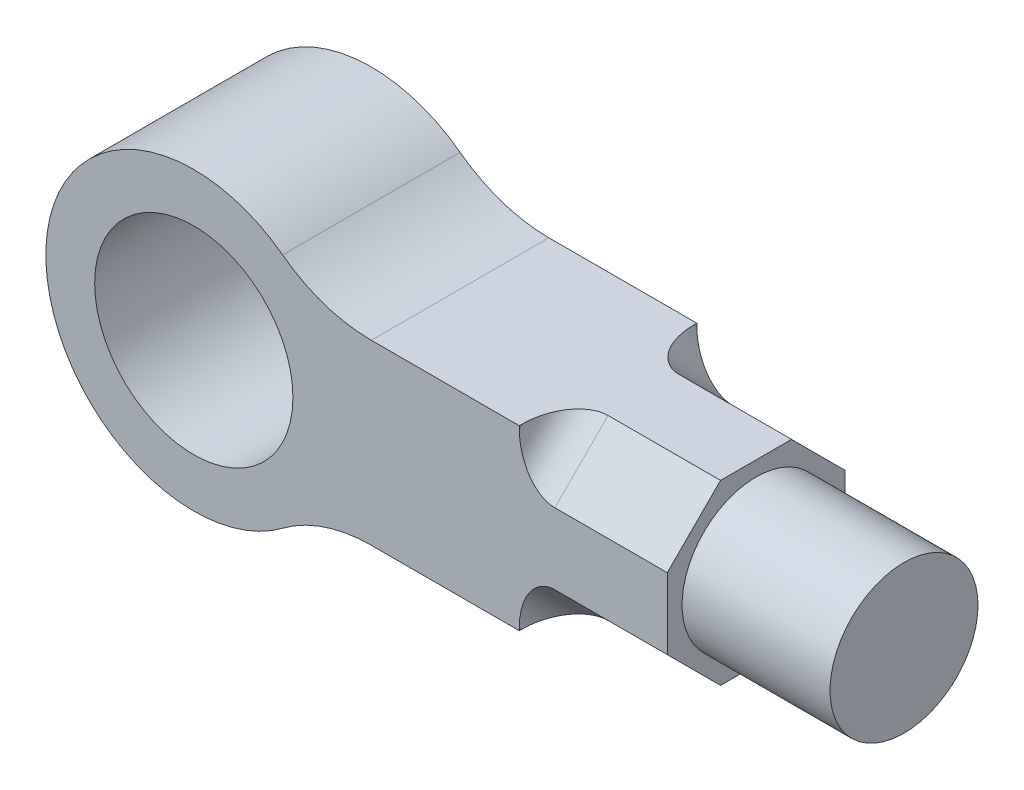
ISO-10303-21;
HEADER;
FILE_DESCRIPTION(('STEP AP214'),'2;1');
FILE_NAME('part.step','',(''),(''),'','','');
FILE_SCHEMA(('AUTOMOTIVE_DESIGN { 1 0 10303 214 1 1 1 1 }'));
ENDSEC;
DATA;
#1=APPLICATION_CONTEXT('core data for automotive mechanical design processes');
#2=APPLICATION_PROTOCOL_DEFINITION('international standard','automotive_design',2000,#1);
#3=PRODUCT_CONTEXT('',#1,'mechanical');
#4=PRODUCT('Part','Part','',(#3));
#5=PRODUCT_RELATED_PRODUCT_CATEGORY('part','',(#4));
#6=PRODUCT_DEFINITION_FORMATION('','',#4);
#7=PRODUCT_DEFINITION_CONTEXT('part definition',#1,'design');
#8=PRODUCT_DEFINITION('design','',#6,#7);
#9=PRODUCT_DEFINITION_SHAPE('','',#8);
#10=(LENGTH_UNIT() NAMED_UNIT(*) SI_UNIT(.MILLI.,.METRE.));
#11=(NAMED_UNIT(*) PLANE_ANGLE_UNIT() SI_UNIT($,.RADIAN.));
#12=(NAMED_UNIT(*) SI_UNIT($,.STERADIAN.) SOLID_ANGLE_UNIT());
#13=UNCERTAINTY_MEASURE_WITH_UNIT(LENGTH_MEASURE(1.E-05),#10,'distance_accuracy_value','');
#14=(GEOMETRIC_REPRESENTATION_CONTEXT(3) GLOBAL_UNCERTAINTY_ASSIGNED_CONTEXT((#13)) GLOBAL_UNIT_ASSIGNED_CONTEXT((#10,
#11,#12)) REPRESENTATION_CONTEXT('',''));
#15=CARTESIAN_POINT('',(0.,0.,0.));
#16=DIRECTION('',(0.,0.,1.));
#17=DIRECTION('',(1.,0.,0.));
#18=AXIS2_PLACEMENT_3D('',#15,#16,#17);
#19=CARTESIAN_POINT('',(60.,-80.,60.));
#20=DIRECTION('',(0.,0.,-1.));
#21=DIRECTION('',(-1.,0.,0.));
#22=AXIS2_PLACEMENT_3D('',#19,#20,#21);
#23=PLANE('',#22);
#24=CARTESIAN_POINT('',(0.,0.,60.));
#25=DIRECTION('',(0.,0.,1.));
#26=DIRECTION('',(1.,0.,0.));
#27=AXIS2_PLACEMENT_3D('',#24,#25,#26);
#28=CIRCLE('',#27,33.5);
#29=CARTESIAN_POINT('',(33.5,0.,60.));
#30=VERTEX_POINT('',#29);
#31=EDGE_CURVE('E355',#30,#30,#28,.T.);
#32=ORIENTED_EDGE('',*,*,#31,.F.);
#33=EDGE_LOOP('',(#32));
#34=FACE_BOUND('',#33,.T.);
#35=DIRECTION('',(0.,-1.,0.));
#36=VECTOR('',#35,1.);
#37=CARTESIAN_POINT('',(110.,0.,60.));
#38=LINE('',#37,#36);
#39=CARTESIAN_POINT('',(110.,-28.9705627484766,60.));
#40=VERTEX_POINT('',#39);
#41=CARTESIAN_POINT('',(110.,-30.,60.));
#42=VERTEX_POINT('',#41);
#43=EDGE_CURVE('E331',#40,#42,#38,.T.);
#44=ORIENTED_EDGE('',*,*,#43,.F.);
#45=CARTESIAN_POINT('',(122.,-28.9705627484766,60.));
#46=DIRECTION('',(0.,0.,-1.));
#47=DIRECTION('',(0.,1.,0.));
#48=AXIS2_PLACEMENT_3D('',#45,#46,#47);
#49=ELLIPSE('',#48,16.9705627484773,12.);
#50=CARTESIAN_POINT('',(122.,-12.0000000000001,60.));
#51=VERTEX_POINT('',#50);
#52=EDGE_CURVE('E245',#40,#51,#49,.T.);
#53=ORIENTED_EDGE('',*,*,#52,.T.);
#54=DIRECTION('',(1.,0.,0.));
#55=VECTOR('',#54,1.);
#56=CARTESIAN_POINT('',(110.,-12.0000000000001,60.));
#57=LINE('',#56,#55);
#58=CARTESIAN_POINT('',(160.,-12.0000000000001,60.));
#59=VERTEX_POINT('',#58);
#60=EDGE_CURVE('E337',#51,#59,#57,.T.);
#61=ORIENTED_EDGE('',*,*,#60,.T.);
#62=DIRECTION('',(0.,1.,0.));
#63=VECTOR('',#62,1.);
#64=CARTESIAN_POINT('',(160.,30.,60.));
#65=LINE('',#64,#63);
#66=CARTESIAN_POINT('',(160.,11.9999999999997,60.));
#67=VERTEX_POINT('',#66);
#68=EDGE_CURVE('E365',#59,#67,#65,.T.);
#69=ORIENTED_EDGE('',*,*,#68,.T.);
#70=DIRECTION('',(1.,0.,0.));
#71=VECTOR('',#70,1.);
#72=CARTESIAN_POINT('',(110.,11.9999999999997,60.));
#73=LINE('',#72,#71);
#74=CARTESIAN_POINT('',(122.,11.9999999999997,60.));
#75=VERTEX_POINT('',#74);
#76=EDGE_CURVE('E351',#75,#67,#73,.T.);
#77=ORIENTED_EDGE('',*,*,#76,.F.);
#78=CARTESIAN_POINT('',(122.,28.9705627484763,60.));
#79=DIRECTION('',(0.,0.,-1.));
#80=DIRECTION('',(0.,1.,0.));
#81=AXIS2_PLACEMENT_3D('',#78,#79,#80);
#82=ELLIPSE('',#81,16.970562748477,12.);
#83=CARTESIAN_POINT('',(110.,28.9705627484763,60.));
#84=VERTEX_POINT('',#83);
#85=EDGE_CURVE('E42',#75,#84,#82,.T.);
#86=ORIENTED_EDGE('',*,*,#85,.T.);
#87=DIRECTION('',(0.,-1.,0.));
#88=VECTOR('',#87,1.);
#89=CARTESIAN_POINT('',(110.,0.,60.));
#90=LINE('',#89,#88);
#91=CARTESIAN_POINT('',(110.,30.,60.));
#92=VERTEX_POINT('',#91);
#93=EDGE_CURVE('E345',#92,#84,#90,.T.);
#94=ORIENTED_EDGE('',*,*,#93,.F.);
#95=DIRECTION('',(-1.,0.,0.));
#96=VECTOR('',#95,1.);
#97=CARTESIAN_POINT('',(60.,30.,60.));
#98=LINE('',#97,#96);
#99=CARTESIAN_POINT('',(60.,30.,60.));
#100=VERTEX_POINT('',#99);
#101=EDGE_CURVE('E368',#92,#100,#98,.T.);
#102=ORIENTED_EDGE('',*,*,#101,.T.);
#103=CARTESIAN_POINT('',(60.,80.,60.));
#104=DIRECTION('',(0.,0.,-1.));
#105=DIRECTION('',(-1.,0.,0.));
#106=AXIS2_PLACEMENT_3D('',#103,#104,#105);
#107=CIRCLE('',#106,50.);
#108=CARTESIAN_POINT('',(30.,40.,60.));
#109=VERTEX_POINT('',#108);
#110=EDGE_CURVE('E370',#100,#109,#107,.T.);
#111=ORIENTED_EDGE('',*,*,#110,.T.);
#112=CARTESIAN_POINT('',(0.,0.,60.));
#113=DIRECTION('',(0.,0.,1.));
#114=DIRECTION('',(1.,0.,0.));
#115=AXIS2_PLACEMENT_3D('',#112,#113,#114);
#116=CIRCLE('',#115,50.);
#117=CARTESIAN_POINT('',(30.,-40.,60.));
#118=VERTEX_POINT('',#117);
#119=EDGE_CURVE('E207',#109,#118,#116,.T.);
#120=ORIENTED_EDGE('',*,*,#119,.T.);
#121=CARTESIAN_POINT('',(60.,-80.,60.));
#122=DIRECTION('',(0.,0.,-1.));
#123=DIRECTION('',(-1.,0.,0.));
#124=AXIS2_PLACEMENT_3D('',#121,#122,#123);
#125=CIRCLE('',#124,50.);
#126=CARTESIAN_POINT('',(60.,-30.,60.));
#127=VERTEX_POINT('',#126);
#128=EDGE_CURVE('E202',#118,#127,#125,.T.);
#129=ORIENTED_EDGE('',*,*,#128,.T.);
#130=DIRECTION('',(1.,0.,0.));
#131=VECTOR('',#130,1.);
#132=CARTESIAN_POINT('',(60.,-30.,60.));
#133=LINE('',#132,#131);
#134=EDGE_CURVE('E362',#127,#42,#133,.T.);
#135=ORIENTED_EDGE('',*,*,#134,.T.);
#136=EDGE_LOOP('',(#44,#53,#61,#69,#77,#86,#94,#102,#111,#120,#129,#135));
#137=FACE_BOUND('',#136,.T.);
#138=ADVANCED_FACE('F34',(#34,#137),#23,.F.);
#139=CARTESIAN_POINT('',(60.,-80.,0.));
#140=DIRECTION('',(0.,0.,-1.));
#141=DIRECTION('',(-1.,0.,0.));
#142=AXIS2_PLACEMENT_3D('',#139,#140,#141);
#143=PLANE('',#142);
#144=CARTESIAN_POINT('',(0.,0.,0.));
#145=DIRECTION('',(0.,0.,1.));
#146=DIRECTION('',(1.,0.,0.));
#147=AXIS2_PLACEMENT_3D('',#144,#145,#146);
#148=CIRCLE('',#147,33.5);
#149=CARTESIAN_POINT('',(33.5,0.,0.));
#150=VERTEX_POINT('',#149);
#151=EDGE_CURVE('E353',#150,#150,#148,.T.);
#152=ORIENTED_EDGE('',*,*,#151,.T.);
#153=EDGE_LOOP('',(#152));
#154=FACE_BOUND('',#153,.T.);
#155=DIRECTION('',(0.,1.,0.));
#156=VECTOR('',#155,1.);
#157=CARTESIAN_POINT('',(160.,30.,0.));
#158=LINE('',#157,#156);
#159=CARTESIAN_POINT('',(160.,-11.9999999999999,0.));
#160=VERTEX_POINT('',#159);
#161=CARTESIAN_POINT('',(160.,12.,0.));
#162=VERTEX_POINT('',#161);
#163=EDGE_CURVE('E163',#160,#162,#158,.T.);
#164=ORIENTED_EDGE('',*,*,#163,.F.);
#165=DIRECTION('',(1.,0.,0.));
#166=VECTOR('',#165,1.);
#167=CARTESIAN_POINT('',(110.,-11.9999999999999,0.));
#168=LINE('',#167,#166);
#169=CARTESIAN_POINT('',(122.,-11.9999999999999,0.));
#170=VERTEX_POINT('',#169);
#171=EDGE_CURVE('E181',#170,#160,#168,.T.);
#172=ORIENTED_EDGE('',*,*,#171,.F.);
#173=CARTESIAN_POINT('',(122.,-28.9705627484775,0.));
#174=DIRECTION('',(0.,0.,-1.));
#175=DIRECTION('',(0.,-1.,0.));
#176=AXIS2_PLACEMENT_3D('',#173,#174,#175);
#177=ELLIPSE('',#176,16.9705627484771,12.);
#178=CARTESIAN_POINT('',(110.,-28.9705627484775,0.));
#179=VERTEX_POINT('',#178);
#180=EDGE_CURVE('E239',#170,#179,#177,.F.);
#181=ORIENTED_EDGE('',*,*,#180,.T.);
#182=DIRECTION('',(0.,1.,0.));
#183=VECTOR('',#182,1.);
#184=CARTESIAN_POINT('',(110.,0.,0.));
#185=LINE('',#184,#183);
#186=CARTESIAN_POINT('',(110.,-30.,0.));
#187=VERTEX_POINT('',#186);
#188=EDGE_CURVE('E324',#187,#179,#185,.T.);
#189=ORIENTED_EDGE('',*,*,#188,.F.);
#190=DIRECTION('',(1.,0.,0.));
#191=VECTOR('',#190,1.);
#192=CARTESIAN_POINT('',(60.,-30.,0.));
#193=LINE('',#192,#191);
#194=CARTESIAN_POINT('',(60.,-30.,0.));
#195=VERTEX_POINT('',#194);
#196=EDGE_CURVE('E190',#195,#187,#193,.T.);
#197=ORIENTED_EDGE('',*,*,#196,.F.);
#198=CARTESIAN_POINT('',(60.,-80.,0.));
#199=DIRECTION('',(0.,0.,-1.));
#200=DIRECTION('',(-1.,0.,0.));
#201=AXIS2_PLACEMENT_3D('',#198,#199,#200);
#202=CIRCLE('',#201,50.);
#203=CARTESIAN_POINT('',(30.,-40.,0.));
#204=VERTEX_POINT('',#203);
#205=EDGE_CURVE('E195',#204,#195,#202,.T.);
#206=ORIENTED_EDGE('',*,*,#205,.F.);
#207=CARTESIAN_POINT('',(0.,0.,0.));
#208=DIRECTION('',(0.,0.,1.));
#209=DIRECTION('',(1.,0.,0.));
#210=AXIS2_PLACEMENT_3D('',#207,#208,#209);
#211=CIRCLE('',#210,50.);
#212=CARTESIAN_POINT('',(30.,40.,0.));
#213=VERTEX_POINT('',#212);
#214=EDGE_CURVE('E200',#213,#204,#211,.T.);
#215=ORIENTED_EDGE('',*,*,#214,.F.);
#216=CARTESIAN_POINT('',(60.,80.,0.));
#217=DIRECTION('',(0.,0.,-1.));
#218=DIRECTION('',(-1.,0.,0.));
#219=AXIS2_PLACEMENT_3D('',#216,#217,#218);
#220=CIRCLE('',#219,50.);
#221=CARTESIAN_POINT('',(60.,30.,0.));
#222=VERTEX_POINT('',#221);
#223=EDGE_CURVE('E192',#222,#213,#220,.T.);
#224=ORIENTED_EDGE('',*,*,#223,.F.);
#225=DIRECTION('',(-1.,0.,0.));
#226=VECTOR('',#225,1.);
#227=CARTESIAN_POINT('',(60.,30.,0.));
#228=LINE('',#227,#226);
#229=CARTESIAN_POINT('',(110.,30.,0.));
#230=VERTEX_POINT('',#229);
#231=EDGE_CURVE('E189',#230,#222,#228,.T.);
#232=ORIENTED_EDGE('',*,*,#231,.F.);
#233=DIRECTION('',(0.,1.,0.));
#234=VECTOR('',#233,1.);
#235=CARTESIAN_POINT('',(110.,0.,0.));
#236=LINE('',#235,#234);
#237=CARTESIAN_POINT('',(110.,28.9705627484771,0.));
#238=VERTEX_POINT('',#237);
#239=EDGE_CURVE('E180',#238,#230,#236,.T.);
#240=ORIENTED_EDGE('',*,*,#239,.F.);
#241=CARTESIAN_POINT('',(122.,28.9705627484771,0.));
#242=DIRECTION('',(0.,0.,-1.));
#243=DIRECTION('',(0.,-1.,0.));
#244=AXIS2_PLACEMENT_3D('',#241,#242,#243);
#245=ELLIPSE('',#244,16.9705627484771,12.);
#246=CARTESIAN_POINT('',(122.,12.,0.));
#247=VERTEX_POINT('',#246);
#248=EDGE_CURVE('E166',#238,#247,#245,.F.);
#249=ORIENTED_EDGE('',*,*,#248,.T.);
#250=DIRECTION('',(1.,0.,0.));
#251=VECTOR('',#250,1.);
#252=CARTESIAN_POINT('',(110.,12.,0.));
#253=LINE('',#252,#251);
#254=EDGE_CURVE('E158',#247,#162,#253,.T.);
#255=ORIENTED_EDGE('',*,*,#254,.T.);
#256=EDGE_LOOP('',(#164,#172,#181,#189,#197,#206,#215,#224,#232,#240,#249,#255));
#257=FACE_BOUND('',#256,.T.);
#258=ADVANCED_FACE('F160',(#154,#257),#143,.T.);
#259=CARTESIAN_POINT('',(60.,-30.,60.));
#260=DIRECTION('',(0.,1.,0.));
#261=DIRECTION('',(0.,0.,1.));
#262=AXIS2_PLACEMENT_3D('',#259,#260,#261);
#263=PLANE('',#262);
#264=DIRECTION('',(1.,0.,0.));
#265=VECTOR('',#264,1.);
#266=CARTESIAN_POINT('',(110.,-30.,41.9999999999994));
#267=LINE('',#266,#265);
#268=CARTESIAN_POINT('',(122.,-30.,41.9999999999994));
#269=VERTEX_POINT('',#268);
#270=CARTESIAN_POINT('',(160.,-30.,41.9999999999994));
#271=VERTEX_POINT('',#270);
#272=EDGE_CURVE('E340',#269,#271,#267,.T.);
#273=ORIENTED_EDGE('',*,*,#272,.F.);
#274=CARTESIAN_POINT('',(122.,-30.,58.9705627484767));
#275=DIRECTION('',(0.,1.,0.));
#276=DIRECTION('',(0.,0.,1.));
#277=AXIS2_PLACEMENT_3D('',#274,#275,#276);
#278=ELLIPSE('',#277,16.970562748477,12.);
#279=CARTESIAN_POINT('',(110.,-30.,58.9705627484767));
#280=VERTEX_POINT('',#279);
#281=EDGE_CURVE('E243',#269,#280,#278,.T.);
#282=ORIENTED_EDGE('',*,*,#281,.T.);
#283=DIRECTION('',(0.,0.,-1.));
#284=VECTOR('',#283,1.);
#285=CARTESIAN_POINT('',(110.,-30.,0.));
#286=LINE('',#285,#284);
#287=EDGE_CURVE('E333',#42,#280,#286,.T.);
#288=ORIENTED_EDGE('',*,*,#287,.F.);
#289=ORIENTED_EDGE('',*,*,#134,.F.);
#290=DIRECTION('',(0.,0.,-1.));
#291=VECTOR('',#290,1.);
#292=CARTESIAN_POINT('',(60.,-30.,60.));
#293=LINE('',#292,#291);
#294=EDGE_CURVE('E217',#127,#195,#293,.T.);
#295=ORIENTED_EDGE('',*,*,#294,.T.);
#296=ORIENTED_EDGE('',*,*,#196,.T.);
#297=DIRECTION('',(0.,0.,-1.));
#298=VECTOR('',#297,1.);
#299=CARTESIAN_POINT('',(110.,-30.,0.));
#300=LINE('',#299,#298);
#301=CARTESIAN_POINT('',(110.,-30.,1.02943725152252));
#302=VERTEX_POINT('',#301);
#303=EDGE_CURVE('E321',#302,#187,#300,.T.);
#304=ORIENTED_EDGE('',*,*,#303,.F.);
#305=CARTESIAN_POINT('',(122.,-30.,1.02943725152252));
#306=DIRECTION('',(0.,1.,0.));
#307=DIRECTION('',(0.,0.,1.));
#308=AXIS2_PLACEMENT_3D('',#305,#306,#307);
#309=ELLIPSE('',#308,16.9705627484772,12.);
#310=CARTESIAN_POINT('',(122.,-30.,17.9999999999995));
#311=VERTEX_POINT('',#310);
#312=EDGE_CURVE('E241',#302,#311,#309,.T.);
#313=ORIENTED_EDGE('',*,*,#312,.T.);
#314=DIRECTION('',(1.,0.,0.));
#315=VECTOR('',#314,1.);
#316=CARTESIAN_POINT('',(110.,-30.,17.9999999999995));
#317=LINE('',#316,#315);
#318=CARTESIAN_POINT('',(160.,-30.,17.9999999999995));
#319=VERTEX_POINT('',#318);
#320=EDGE_CURVE('E320',#311,#319,#317,.T.);
#321=ORIENTED_EDGE('',*,*,#320,.T.);
#322=DIRECTION('',(0.,0.,-1.));
#323=VECTOR('',#322,1.);
#324=CARTESIAN_POINT('',(160.,-30.,60.));
#325=LINE('',#324,#323);
#326=EDGE_CURVE('E215',#271,#319,#325,.T.);
#327=ORIENTED_EDGE('',*,*,#326,.F.);
#328=EDGE_LOOP('',(#273,#282,#288,#289,#295,#296,#304,#313,#321,#327));
#329=FACE_BOUND('',#328,.T.);
#330=ADVANCED_FACE('F276',(#329),#263,.F.);
#331=CARTESIAN_POINT('',(160.,30.,60.));
#332=DIRECTION('',(-1.,0.,0.));
#333=DIRECTION('',(0.,0.,1.));
#334=AXIS2_PLACEMENT_3D('',#331,#332,#333);
#335=PLANE('',#334);
#336=CARTESIAN_POINT('',(160.,0.,30.));
#337=DIRECTION('',(1.,0.,0.));
#338=DIRECTION('',(0.,0.,-1.));
#339=AXIS2_PLACEMENT_3D('',#336,#337,#338);
#340=CIRCLE('',#339,25.);
#341=CARTESIAN_POINT('',(160.,0.,5.));
#342=VERTEX_POINT('',#341);
#343=EDGE_CURVE('E220',#342,#342,#340,.T.);
#344=ORIENTED_EDGE('',*,*,#343,.F.);
#345=EDGE_LOOP('',(#344));
#346=FACE_BOUND('',#345,.T.);
#347=DIRECTION('',(0.,-0.707106781186553,-0.707106781186543));
#348=VECTOR('',#347,1.);
#349=CARTESIAN_POINT('',(160.,-35.9999999999996,36.0000000000001));
#350=LINE('',#349,#348);
#351=EDGE_CURVE('E334',#59,#271,#350,.T.);
#352=ORIENTED_EDGE('',*,*,#351,.T.);
#353=ORIENTED_EDGE('',*,*,#326,.T.);
#354=DIRECTION('',(0.,0.707106781186545,-0.70710678118655));
#355=VECTOR('',#354,1.);
#356=CARTESIAN_POINT('',(160.,-6.00000000000024,-6.0000000000002));
#357=LINE('',#356,#355);
#358=EDGE_CURVE('E188',#319,#160,#357,.T.);
#359=ORIENTED_EDGE('',*,*,#358,.T.);
#360=ORIENTED_EDGE('',*,*,#163,.T.);
#361=DIRECTION('',(0.,0.707106781186547,0.707106781186548));
#362=VECTOR('',#361,1.);
#363=CARTESIAN_POINT('',(160.,6.,-6.));
#364=LINE('',#363,#362);
#365=CARTESIAN_POINT('',(160.,30.,18.));
#366=VERTEX_POINT('',#365);
#367=EDGE_CURVE('E174',#162,#366,#364,.T.);
#368=ORIENTED_EDGE('',*,*,#367,.T.);
#369=DIRECTION('',(0.,0.,-1.));
#370=VECTOR('',#369,1.);
#371=CARTESIAN_POINT('',(160.,30.,60.));
#372=LINE('',#371,#370);
#373=CARTESIAN_POINT('',(160.,30.,41.9999999999994));
#374=VERTEX_POINT('',#373);
#375=EDGE_CURVE('E213',#374,#366,#372,.T.);
#376=ORIENTED_EDGE('',*,*,#375,.F.);
#377=DIRECTION('',(0.,-0.70710678118654,0.707106781186555));
#378=VECTOR('',#377,1.);
#379=CARTESIAN_POINT('',(160.,35.9999999999998,35.999999999999));
#380=LINE('',#379,#378);
#381=EDGE_CURVE('E346',#374,#67,#380,.T.);
#382=ORIENTED_EDGE('',*,*,#381,.T.);
#383=ORIENTED_EDGE('',*,*,#68,.F.);
#384=EDGE_LOOP('',(#352,#353,#359,#360,#368,#376,#382,#383));
#385=FACE_BOUND('',#384,.T.);
#386=ADVANCED_FACE('F185',(#346,#385),#335,.F.);
#387=CARTESIAN_POINT('',(60.,30.,60.));
#388=DIRECTION('',(0.,-1.,0.));
#389=DIRECTION('',(0.,0.,-1.));
#390=AXIS2_PLACEMENT_3D('',#387,#388,#389);
#391=PLANE('',#390);
#392=DIRECTION('',(1.,0.,0.));
#393=VECTOR('',#392,1.);
#394=CARTESIAN_POINT('',(110.,30.,18.));
#395=LINE('',#394,#393);
#396=CARTESIAN_POINT('',(122.,30.,18.));
#397=VERTEX_POINT('',#396);
#398=EDGE_CURVE('E170',#397,#366,#395,.T.);
#399=ORIENTED_EDGE('',*,*,#398,.F.);
#400=CARTESIAN_POINT('',(122.,30.,1.02943725152286));
#401=DIRECTION('',(0.,-1.,0.));
#402=DIRECTION('',(0.,0.,-1.));
#403=AXIS2_PLACEMENT_3D('',#400,#401,#402);
#404=ELLIPSE('',#403,16.9705627484771,12.);
#405=CARTESIAN_POINT('',(110.,30.,1.02943725152286));
#406=VERTEX_POINT('',#405);
#407=EDGE_CURVE('E247',#397,#406,#404,.T.);
#408=ORIENTED_EDGE('',*,*,#407,.T.);
#409=DIRECTION('',(0.,0.,1.));
#410=VECTOR('',#409,1.);
#411=CARTESIAN_POINT('',(110.,30.,0.));
#412=LINE('',#411,#410);
#413=EDGE_CURVE('E171',#230,#406,#412,.T.);
#414=ORIENTED_EDGE('',*,*,#413,.F.);
#415=ORIENTED_EDGE('',*,*,#231,.T.);
#416=DIRECTION('',(0.,0.,-1.));
#417=VECTOR('',#416,1.);
#418=CARTESIAN_POINT('',(60.,30.,60.));
#419=LINE('',#418,#417);
#420=EDGE_CURVE('E210',#100,#222,#419,.T.);
#421=ORIENTED_EDGE('',*,*,#420,.F.);
#422=ORIENTED_EDGE('',*,*,#101,.F.);
#423=DIRECTION('',(0.,0.,1.));
#424=VECTOR('',#423,1.);
#425=CARTESIAN_POINT('',(110.,30.,0.));
#426=LINE('',#425,#424);
#427=CARTESIAN_POINT('',(110.,30.,58.9705627484763));
#428=VERTEX_POINT('',#427);
#429=EDGE_CURVE('E343',#428,#92,#426,.T.);
#430=ORIENTED_EDGE('',*,*,#429,.F.);
#431=CARTESIAN_POINT('',(122.,30.,58.9705627484763));
#432=DIRECTION('',(0.,-1.,0.));
#433=DIRECTION('',(0.,0.,-1.));
#434=AXIS2_PLACEMENT_3D('',#431,#432,#433);
#435=ELLIPSE('',#434,16.9705627484773,12.);
#436=CARTESIAN_POINT('',(122.,30.,41.9999999999994));
#437=VERTEX_POINT('',#436);
#438=EDGE_CURVE('E11',#428,#437,#435,.T.);
#439=ORIENTED_EDGE('',*,*,#438,.T.);
#440=DIRECTION('',(1.,0.,0.));
#441=VECTOR('',#440,1.);
#442=CARTESIAN_POINT('',(110.,30.,41.9999999999994));
#443=LINE('',#442,#441);
#444=EDGE_CURVE('E348',#437,#374,#443,.T.);
#445=ORIENTED_EDGE('',*,*,#444,.T.);
#446=ORIENTED_EDGE('',*,*,#375,.T.);
#447=EDGE_LOOP('',(#399,#408,#414,#415,#421,#422,#430,#439,#445,#446));
#448=FACE_BOUND('',#447,.T.);
#449=ADVANCED_FACE('F252',(#448),#391,.F.);
#450=CARTESIAN_POINT('',(60.,-80.,60.));
#451=DIRECTION('',(0.,0.,-1.));
#452=DIRECTION('',(-1.,0.,0.));
#453=AXIS2_PLACEMENT_3D('',#450,#451,#452);
#454=CYLINDRICAL_SURFACE('',#453,50.);
#455=ORIENTED_EDGE('',*,*,#205,.T.);
#456=ORIENTED_EDGE('',*,*,#294,.F.);
#457=ORIENTED_EDGE('',*,*,#128,.F.);
#458=DIRECTION('',(0.,0.,-1.));
#459=VECTOR('',#458,1.);
#460=CARTESIAN_POINT('',(30.,-40.,60.));
#461=LINE('',#460,#459);
#462=EDGE_CURVE('E203',#118,#204,#461,.T.);
#463=ORIENTED_EDGE('',*,*,#462,.T.);
#464=EDGE_LOOP('',(#455,#456,#457,#463));
#465=FACE_BOUND('',#464,.T.);
#466=ADVANCED_FACE('F291',(#465),#454,.F.);
#467=CARTESIAN_POINT('',(60.,80.,60.));
#468=DIRECTION('',(0.,0.,-1.));
#469=DIRECTION('',(-1.,0.,0.));
#470=AXIS2_PLACEMENT_3D('',#467,#468,#469);
#471=CYLINDRICAL_SURFACE('',#470,50.);
#472=ORIENTED_EDGE('',*,*,#223,.T.);
#473=DIRECTION('',(0.,0.,-1.));
#474=VECTOR('',#473,1.);
#475=CARTESIAN_POINT('',(30.,40.,60.));
#476=LINE('',#475,#474);
#477=EDGE_CURVE('E206',#109,#213,#476,.T.);
#478=ORIENTED_EDGE('',*,*,#477,.F.);
#479=ORIENTED_EDGE('',*,*,#110,.F.);
#480=ORIENTED_EDGE('',*,*,#420,.T.);
#481=EDGE_LOOP('',(#472,#478,#479,#480));
#482=FACE_BOUND('',#481,.T.);
#483=ADVANCED_FACE('F287',(#482),#471,.F.);
#484=CARTESIAN_POINT('',(0.,0.,60.));
#485=DIRECTION('',(0.,0.,-1.));
#486=DIRECTION('',(-1.,0.,0.));
#487=AXIS2_PLACEMENT_3D('',#484,#485,#486);
#488=CYLINDRICAL_SURFACE('',#487,50.);
#489=ORIENTED_EDGE('',*,*,#214,.T.);
#490=ORIENTED_EDGE('',*,*,#462,.F.);
#491=ORIENTED_EDGE('',*,*,#119,.F.);
#492=ORIENTED_EDGE('',*,*,#477,.T.);
#493=EDGE_LOOP('',(#489,#490,#491,#492));
#494=FACE_BOUND('',#493,.T.);
#495=ADVANCED_FACE('F284',(#494),#488,.T.);
#496=CARTESIAN_POINT('',(0.,0.,60.));
#497=DIRECTION('',(0.,0.,-1.));
#498=DIRECTION('',(-1.,0.,0.));
#499=AXIS2_PLACEMENT_3D('',#496,#497,#498);
#500=CYLINDRICAL_SURFACE('',#499,33.5);
#501=ORIENTED_EDGE('',*,*,#31,.T.);
#502=EDGE_LOOP('',(#501));
#503=FACE_BOUND('',#502,.T.);
#504=ORIENTED_EDGE('',*,*,#151,.F.);
#505=EDGE_LOOP('',(#504));
#506=FACE_BOUND('',#505,.T.);
#507=ADVANCED_FACE('F281',(#503,#506),#500,.F.);
#508=CARTESIAN_POINT('',(110.,35.9999999999998,35.999999999999));
#509=DIRECTION('',(0.,0.707106781186555,0.70710678118654));
#510=DIRECTION('',(0.,-0.70710678118654,0.707106781186555));
#511=AXIS2_PLACEMENT_3D('',#508,#509,#510);
#512=PLANE('',#511);
#513=ORIENTED_EDGE('',*,*,#444,.F.);
#514=DIRECTION('',(0.,-0.70710678118654,0.707106781186555));
#515=VECTOR('',#514,1.);
#516=CARTESIAN_POINT('',(122.,11.9999999999996,59.9999999999998));
#517=LINE('',#516,#515);
#518=EDGE_CURVE('E235',#437,#75,#517,.T.);
#519=ORIENTED_EDGE('',*,*,#518,.T.);
#520=ORIENTED_EDGE('',*,*,#76,.T.);
#521=ORIENTED_EDGE('',*,*,#381,.F.);
#522=EDGE_LOOP('',(#513,#519,#520,#521));
#523=FACE_BOUND('',#522,.T.);
#524=ADVANCED_FACE('F393',(#523),#512,.T.);
#525=CARTESIAN_POINT('',(110.,0.,0.));
#526=DIRECTION('',(1.,0.,0.));
#527=DIRECTION('',(0.,0.,-1.));
#528=AXIS2_PLACEMENT_3D('',#525,#526,#527);
#529=PLANE('',#528);
#530=ORIENTED_EDGE('',*,*,#93,.T.);
#531=DIRECTION('',(0.,-0.70710678118654,0.707106781186555));
#532=VECTOR('',#531,1.);
#533=CARTESIAN_POINT('',(110.,38.4852813742384,50.4852813742377));
#534=LINE('',#533,#532);
#535=EDGE_CURVE('E55',#84,#428,#534,.F.);
#536=ORIENTED_EDGE('',*,*,#535,.T.);
#537=ORIENTED_EDGE('',*,*,#429,.T.);
#538=EDGE_LOOP('',(#530,#536,#537));
#539=FACE_BOUND('',#538,.T.);
#540=ADVANCED_FACE('F388',(#539),#529,.T.);
#541=CARTESIAN_POINT('',(110.,6.,-6.));
#542=DIRECTION('',(0.,0.707106781186548,-0.707106781186547));
#543=DIRECTION('',(0.,0.707106781186547,0.707106781186548));
#544=AXIS2_PLACEMENT_3D('',#541,#542,#543);
#545=PLANE('',#544);
#546=ORIENTED_EDGE('',*,*,#254,.F.);
#547=DIRECTION('',(0.,0.707106781186547,0.707106781186548));
#548=VECTOR('',#547,1.);
#549=CARTESIAN_POINT('',(122.,30.,18.));
#550=LINE('',#549,#548);
#551=EDGE_CURVE('E231',#247,#397,#550,.T.);
#552=ORIENTED_EDGE('',*,*,#551,.T.);
#553=ORIENTED_EDGE('',*,*,#398,.T.);
#554=ORIENTED_EDGE('',*,*,#367,.F.);
#555=EDGE_LOOP('',(#546,#552,#553,#554));
#556=FACE_BOUND('',#555,.T.);
#557=ADVANCED_FACE('F175',(#556),#545,.T.);
#558=CARTESIAN_POINT('',(110.,0.,0.));
#559=DIRECTION('',(1.,0.,0.));
#560=DIRECTION('',(0.,0.,-1.));
#561=AXIS2_PLACEMENT_3D('',#558,#559,#560);
#562=PLANE('',#561);
#563=ORIENTED_EDGE('',*,*,#413,.T.);
#564=DIRECTION('',(0.,0.707106781186547,0.707106781186548));
#565=VECTOR('',#564,1.);
#566=CARTESIAN_POINT('',(110.,20.4852813742386,-8.48528137423857));
#567=LINE('',#566,#565);
#568=EDGE_CURVE('E233',#406,#238,#567,.F.);
#569=ORIENTED_EDGE('',*,*,#568,.T.);
#570=ORIENTED_EDGE('',*,*,#239,.T.);
#571=EDGE_LOOP('',(#563,#569,#570));
#572=FACE_BOUND('',#571,.T.);
#573=ADVANCED_FACE('F257',(#572),#562,.T.);
#574=CARTESIAN_POINT('',(110.,-6.00000000000024,-6.0000000000002));
#575=DIRECTION('',(0.,-0.70710678118655,-0.707106781186545));
#576=DIRECTION('',(0.,0.707106781186545,-0.70710678118655));
#577=AXIS2_PLACEMENT_3D('',#574,#575,#576);
#578=PLANE('',#577);
#579=ORIENTED_EDGE('',*,*,#320,.F.);
#580=DIRECTION('',(0.,0.707106781186545,-0.70710678118655));
#581=VECTOR('',#580,1.);
#582=CARTESIAN_POINT('',(122.,-12.0000000000001,-2.70616862252382E-13));
#583=LINE('',#582,#581);
#584=EDGE_CURVE('E221',#311,#170,#583,.T.);
#585=ORIENTED_EDGE('',*,*,#584,.T.);
#586=ORIENTED_EDGE('',*,*,#171,.T.);
#587=ORIENTED_EDGE('',*,*,#358,.F.);
#588=EDGE_LOOP('',(#579,#585,#586,#587));
#589=FACE_BOUND('',#588,.T.);
#590=ADVANCED_FACE('F323',(#589),#578,.T.);
#591=CARTESIAN_POINT('',(110.,0.,0.));
#592=DIRECTION('',(1.,0.,0.));
#593=DIRECTION('',(0.,0.,-1.));
#594=AXIS2_PLACEMENT_3D('',#591,#592,#593);
#595=PLANE('',#594);
#596=ORIENTED_EDGE('',*,*,#188,.T.);
#597=DIRECTION('',(0.,0.707106781186545,-0.70710678118655));
#598=VECTOR('',#597,1.);
#599=CARTESIAN_POINT('',(110.,-38.4852813742385,9.51471862576108));
#600=LINE('',#599,#598);
#601=EDGE_CURVE('E224',#179,#302,#600,.F.);
#602=ORIENTED_EDGE('',*,*,#601,.T.);
#603=ORIENTED_EDGE('',*,*,#303,.T.);
#604=EDGE_LOOP('',(#596,#602,#603));
#605=FACE_BOUND('',#604,.T.);
#606=ADVANCED_FACE('F412',(#605),#595,.T.);
#607=CARTESIAN_POINT('',(110.,-35.9999999999996,36.0000000000001));
#608=DIRECTION('',(0.,-0.707106781186543,0.707106781186553));
#609=DIRECTION('',(0.,-0.707106781186553,-0.707106781186543));
#610=AXIS2_PLACEMENT_3D('',#607,#608,#609);
#611=PLANE('',#610);
#612=ORIENTED_EDGE('',*,*,#60,.F.);
#613=DIRECTION('',(0.,-0.707106781186553,-0.707106781186543));
#614=VECTOR('',#613,1.);
#615=CARTESIAN_POINT('',(122.,-30.0000000000001,41.9999999999995));
#616=LINE('',#615,#614);
#617=EDGE_CURVE('E226',#51,#269,#616,.T.);
#618=ORIENTED_EDGE('',*,*,#617,.T.);
#619=ORIENTED_EDGE('',*,*,#272,.T.);
#620=ORIENTED_EDGE('',*,*,#351,.F.);
#621=EDGE_LOOP('',(#612,#618,#619,#620));
#622=FACE_BOUND('',#621,.T.);
#623=ADVANCED_FACE('F400',(#622),#611,.T.);
#624=CARTESIAN_POINT('',(110.,0.,0.));
#625=DIRECTION('',(1.,0.,0.));
#626=DIRECTION('',(0.,0.,-1.));
#627=AXIS2_PLACEMENT_3D('',#624,#625,#626);
#628=PLANE('',#627);
#629=ORIENTED_EDGE('',*,*,#287,.T.);
#630=DIRECTION('',(0.,-0.707106781186553,-0.707106781186543));
#631=VECTOR('',#630,1.);
#632=CARTESIAN_POINT('',(110.,-20.4852813742383,68.4852813742383));
#633=LINE('',#632,#631);
#634=EDGE_CURVE('E229',#280,#40,#633,.F.);
#635=ORIENTED_EDGE('',*,*,#634,.T.);
#636=ORIENTED_EDGE('',*,*,#43,.T.);
#637=EDGE_LOOP('',(#629,#635,#636));
#638=FACE_BOUND('',#637,.T.);
#639=ADVANCED_FACE('F403',(#638),#628,.T.);
#640=CARTESIAN_POINT('',(210.,0.,30.));
#641=DIRECTION('',(-1.,0.,0.));
#642=DIRECTION('',(0.,0.,1.));
#643=AXIS2_PLACEMENT_3D('',#640,#641,#642);
#644=CYLINDRICAL_SURFACE('',#643,25.);
#645=CARTESIAN_POINT('',(210.,0.,30.));
#646=DIRECTION('',(1.,0.,0.));
#647=DIRECTION('',(0.,0.,-1.));
#648=AXIS2_PLACEMENT_3D('',#645,#646,#647);
#649=CIRCLE('',#648,25.);
#650=CARTESIAN_POINT('',(210.,0.,5.));
#651=VERTEX_POINT('',#650);
#652=EDGE_CURVE('E339',#651,#651,#649,.T.);
#653=ORIENTED_EDGE('',*,*,#652,.F.);
#654=EDGE_LOOP('',(#653));
#655=FACE_BOUND('',#654,.T.);
#656=ORIENTED_EDGE('',*,*,#343,.T.);
#657=EDGE_LOOP('',(#656));
#658=FACE_BOUND('',#657,.T.);
#659=ADVANCED_FACE('F310',(#655,#658),#644,.T.);
#660=CARTESIAN_POINT('',(210.,0.,0.));
#661=DIRECTION('',(1.,0.,0.));
#662=DIRECTION('',(0.,0.,-1.));
#663=AXIS2_PLACEMENT_3D('',#660,#661,#662);
#664=PLANE('',#663);
#665=ORIENTED_EDGE('',*,*,#652,.T.);
#666=EDGE_LOOP('',(#665));
#667=FACE_BOUND('',#666,.T.);
#668=ADVANCED_FACE('F305',(#667),#664,.T.);
#669=CARTESIAN_POINT('',(122.,-14.4852813742388,-14.4852813742387));
#670=DIRECTION('',(0.,-0.707106781186545,0.70710678118655));
#671=DIRECTION('',(0.,-0.70710678118655,-0.707106781186545));
#672=AXIS2_PLACEMENT_3D('',#669,#670,#671);
#673=CYLINDRICAL_SURFACE('',#672,12.);
#674=ORIENTED_EDGE('',*,*,#312,.F.);
#675=ORIENTED_EDGE('',*,*,#601,.F.);
#676=ORIENTED_EDGE('',*,*,#180,.F.);
#677=ORIENTED_EDGE('',*,*,#584,.F.);
#678=EDGE_LOOP('',(#674,#675,#676,#677));
#679=FACE_BOUND('',#678,.T.);
#680=ADVANCED_FACE('F267',(#679),#673,.F.);
#681=CARTESIAN_POINT('',(122.,-44.4852813742381,44.4852813742387));
#682=DIRECTION('',(0.,0.707106781186553,0.707106781186543));
#683=DIRECTION('',(0.,-0.707106781186543,0.707106781186553));
#684=AXIS2_PLACEMENT_3D('',#681,#682,#683);
#685=CYLINDRICAL_SURFACE('',#684,12.);
#686=ORIENTED_EDGE('',*,*,#52,.F.);
#687=ORIENTED_EDGE('',*,*,#634,.F.);
#688=ORIENTED_EDGE('',*,*,#281,.F.);
#689=ORIENTED_EDGE('',*,*,#617,.F.);
#690=EDGE_LOOP('',(#686,#687,#688,#689));
#691=FACE_BOUND('',#690,.T.);
#692=ADVANCED_FACE('F261',(#691),#685,.F.);
#693=CARTESIAN_POINT('',(122.,14.4852813742386,-14.4852813742386));
#694=DIRECTION('',(0.,-0.707106781186547,-0.707106781186548));
#695=DIRECTION('',(0.,0.707106781186548,-0.707106781186547));
#696=AXIS2_PLACEMENT_3D('',#693,#694,#695);
#697=CYLINDRICAL_SURFACE('',#696,12.);
#698=ORIENTED_EDGE('',*,*,#248,.F.);
#699=ORIENTED_EDGE('',*,*,#568,.F.);
#700=ORIENTED_EDGE('',*,*,#407,.F.);
#701=ORIENTED_EDGE('',*,*,#551,.F.);
#702=EDGE_LOOP('',(#698,#699,#700,#701));
#703=FACE_BOUND('',#702,.T.);
#704=ADVANCED_FACE('F259',(#703),#697,.F.);
#705=CARTESIAN_POINT('',(122.,44.4852813742385,44.4852813742375));
#706=DIRECTION('',(0.,0.70710678118654,-0.707106781186555));
#707=DIRECTION('',(0.,0.707106781186555,0.70710678118654));
#708=AXIS2_PLACEMENT_3D('',#705,#706,#707);
#709=CYLINDRICAL_SURFACE('',#708,12.);
#710=ORIENTED_EDGE('',*,*,#438,.F.);
#711=ORIENTED_EDGE('',*,*,#535,.F.);
#712=ORIENTED_EDGE('',*,*,#85,.F.);
#713=ORIENTED_EDGE('',*,*,#518,.F.);
#714=EDGE_LOOP('',(#710,#711,#712,#713));
#715=FACE_BOUND('',#714,.T.);
#716=ADVANCED_FACE('F36',(#715),#709,.F.);
#717=CLOSED_SHELL('',(#138,#258,#330,#386,#449,#466,#483,#495,#507,#524,#540,#557,#573,#590,
#606,#623,#639,#659,#668,#680,#692,#704,#716));
#718=MANIFOLD_SOLID_BREP('B2',#717);
#719=ADVANCED_BREP_SHAPE_REPRESENTATION('',(#18,#718),#14);
#720=SHAPE_DEFINITION_REPRESENTATION(#9,#719);
ENDSEC;
END-ISO-10303-21;
